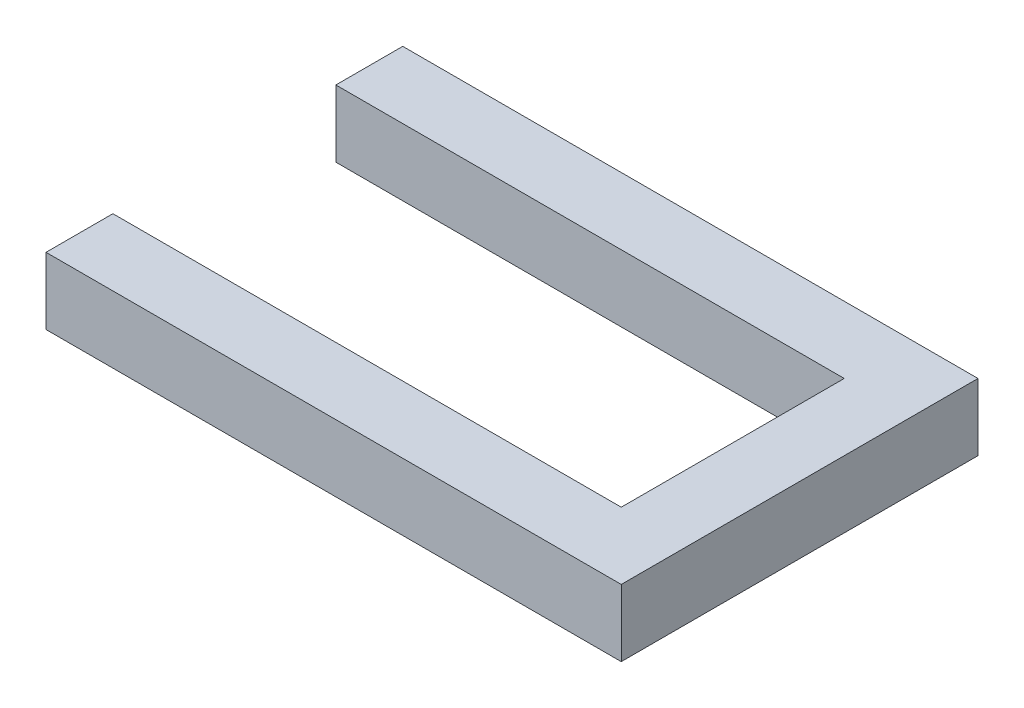
ISO-10303-21;
HEADER;
FILE_DESCRIPTION(('STEP AP214'),'2;1');
FILE_NAME('part.step','',(''),(''),'','','');
FILE_SCHEMA(('AUTOMOTIVE_DESIGN { 1 0 10303 214 1 1 1 1 }'));
ENDSEC;
DATA;
#1=APPLICATION_CONTEXT('core data for automotive mechanical design processes');
#2=APPLICATION_PROTOCOL_DEFINITION('international standard','automotive_design',2000,#1);
#3=PRODUCT_CONTEXT('',#1,'mechanical');
#4=PRODUCT('Part','Part','',(#3));
#5=PRODUCT_RELATED_PRODUCT_CATEGORY('part','',(#4));
#6=PRODUCT_DEFINITION_FORMATION('','',#4);
#7=PRODUCT_DEFINITION_CONTEXT('part definition',#1,'design');
#8=PRODUCT_DEFINITION('design','',#6,#7);
#9=PRODUCT_DEFINITION_SHAPE('','',#8);
#10=(LENGTH_UNIT() NAMED_UNIT(*) SI_UNIT(.MILLI.,.METRE.));
#11=(NAMED_UNIT(*) PLANE_ANGLE_UNIT() SI_UNIT($,.RADIAN.));
#12=(NAMED_UNIT(*) SI_UNIT($,.STERADIAN.) SOLID_ANGLE_UNIT());
#13=UNCERTAINTY_MEASURE_WITH_UNIT(LENGTH_MEASURE(1.E-05),#10,'distance_accuracy_value','');
#14=(GEOMETRIC_REPRESENTATION_CONTEXT(3) GLOBAL_UNCERTAINTY_ASSIGNED_CONTEXT((#13)) GLOBAL_UNIT_ASSIGNED_CONTEXT((#10,
#11,#12)) REPRESENTATION_CONTEXT('',''));
#15=CARTESIAN_POINT('',(0.,0.,0.));
#16=DIRECTION('',(0.,0.,1.));
#17=DIRECTION('',(1.,0.,0.));
#18=AXIS2_PLACEMENT_3D('',#15,#16,#17);
#19=CARTESIAN_POINT('',(-127.,6.34999999999999,-101.6));
#20=DIRECTION('',(-1.,0.,0.));
#21=DIRECTION('',(0.,0.,1.));
#22=AXIS2_PLACEMENT_3D('',#19,#20,#21);
#23=PLANE('',#22);
#24=DIRECTION('',(0.,0.,1.));
#25=VECTOR('',#24,1.);
#26=CARTESIAN_POINT('',(-127.,6.34999999999999,-101.6));
#27=LINE('',#26,#25);
#28=CARTESIAN_POINT('',(-127.,6.34999999999999,-63.5));
#29=VERTEX_POINT('',#28);
#30=CARTESIAN_POINT('',(-127.,6.34999999999999,63.5));
#31=VERTEX_POINT('',#30);
#32=EDGE_CURVE('E53',#29,#31,#27,.T.);
#33=ORIENTED_EDGE('',*,*,#32,.F.);
#34=DIRECTION('',(0.,1.,0.));
#35=VECTOR('',#34,1.);
#36=CARTESIAN_POINT('',(-127.,6.34999999999999,-63.5));
#37=LINE('',#36,#35);
#38=CARTESIAN_POINT('',(-127.,-31.75,-63.5));
#39=VERTEX_POINT('',#38);
#40=EDGE_CURVE('E48',#39,#29,#37,.T.);
#41=ORIENTED_EDGE('',*,*,#40,.F.);
#42=DIRECTION('',(0.,0.,1.));
#43=VECTOR('',#42,1.);
#44=CARTESIAN_POINT('',(-127.,-31.75,-101.6));
#45=LINE('',#44,#43);
#46=CARTESIAN_POINT('',(-127.,-31.75,63.5));
#47=VERTEX_POINT('',#46);
#48=EDGE_CURVE('E35',#39,#47,#45,.T.);
#49=ORIENTED_EDGE('',*,*,#48,.T.);
#50=DIRECTION('',(0.,-1.,0.));
#51=VECTOR('',#50,1.);
#52=CARTESIAN_POINT('',(-127.,6.34999999999998,63.5));
#53=LINE('',#52,#51);
#54=EDGE_CURVE('E135',#31,#47,#53,.T.);
#55=ORIENTED_EDGE('',*,*,#54,.F.);
#56=EDGE_LOOP('',(#33,#41,#49,#55));
#57=FACE_BOUND('',#56,.T.);
#58=ADVANCED_FACE('F31',(#57),#23,.T.);
#59=CARTESIAN_POINT('',(-88.9,6.34999999999999,-101.6));
#60=DIRECTION('',(1.,0.,0.));
#61=DIRECTION('',(0.,0.,-1.));
#62=AXIS2_PLACEMENT_3D('',#59,#60,#61);
#63=PLANE('',#62);
#64=DIRECTION('',(0.,0.,1.));
#65=VECTOR('',#64,1.);
#66=CARTESIAN_POINT('',(-88.9,6.34999999999999,-101.6));
#67=LINE('',#66,#65);
#68=CARTESIAN_POINT('',(-88.9,6.34999999999999,-101.6));
#69=VERTEX_POINT('',#68);
#70=CARTESIAN_POINT('',(-88.9,6.34999999999999,101.6));
#71=VERTEX_POINT('',#70);
#72=EDGE_CURVE('E148',#69,#71,#67,.T.);
#73=ORIENTED_EDGE('',*,*,#72,.T.);
#74=DIRECTION('',(0.,1.,0.));
#75=VECTOR('',#74,1.);
#76=CARTESIAN_POINT('',(-88.9,6.34999999999999,101.6));
#77=LINE('',#76,#75);
#78=CARTESIAN_POINT('',(-88.9,-31.75,101.6));
#79=VERTEX_POINT('',#78);
#80=EDGE_CURVE('E130',#79,#71,#77,.T.);
#81=ORIENTED_EDGE('',*,*,#80,.F.);
#82=DIRECTION('',(0.,0.,1.));
#83=VECTOR('',#82,1.);
#84=CARTESIAN_POINT('',(-88.9,-31.75,-101.6));
#85=LINE('',#84,#83);
#86=CARTESIAN_POINT('',(-88.9,-31.75,-101.6));
#87=VERTEX_POINT('',#86);
#88=EDGE_CURVE('E11',#87,#79,#85,.T.);
#89=ORIENTED_EDGE('',*,*,#88,.F.);
#90=DIRECTION('',(0.,1.,0.));
#91=VECTOR('',#90,1.);
#92=CARTESIAN_POINT('',(-88.9,6.34999999999999,-101.6));
#93=LINE('',#92,#91);
#94=EDGE_CURVE('E275',#87,#69,#93,.T.);
#95=ORIENTED_EDGE('',*,*,#94,.T.);
#96=EDGE_LOOP('',(#73,#81,#89,#95));
#97=FACE_BOUND('',#96,.T.);
#98=ADVANCED_FACE('F33',(#97),#63,.T.);
#99=CARTESIAN_POINT('',(-88.9,-31.75,-101.6));
#100=DIRECTION('',(0.,-1.,0.));
#101=DIRECTION('',(1.,0.,0.));
#102=AXIS2_PLACEMENT_3D('',#99,#100,#101);
#103=PLANE('',#102);
#104=ORIENTED_EDGE('',*,*,#88,.T.);
#105=DIRECTION('',(1.,0.,0.));
#106=VECTOR('',#105,1.);
#107=CARTESIAN_POINT('',(-88.9,-31.75,101.6));
#108=LINE('',#107,#106);
#109=CARTESIAN_POINT('',(-416.560000000226,-31.75,101.6));
#110=VERTEX_POINT('',#109);
#111=EDGE_CURVE('E269',#110,#79,#108,.T.);
#112=ORIENTED_EDGE('',*,*,#111,.F.);
#113=DIRECTION('',(0.,0.,-1.));
#114=VECTOR('',#113,1.);
#115=CARTESIAN_POINT('',(-416.560000000226,-31.75,101.6));
#116=LINE('',#115,#114);
#117=CARTESIAN_POINT('',(-416.560000000226,-31.75,63.5));
#118=VERTEX_POINT('',#117);
#119=EDGE_CURVE('E124',#110,#118,#116,.T.);
#120=ORIENTED_EDGE('',*,*,#119,.T.);
#121=DIRECTION('',(1.,0.,0.));
#122=VECTOR('',#121,1.);
#123=CARTESIAN_POINT('',(-470.441536726641,-31.75,63.5));
#124=LINE('',#123,#122);
#125=EDGE_CURVE('E139',#118,#47,#124,.T.);
#126=ORIENTED_EDGE('',*,*,#125,.T.);
#127=ORIENTED_EDGE('',*,*,#48,.F.);
#128=DIRECTION('',(1.,0.,0.));
#129=VECTOR('',#128,1.);
#130=CARTESIAN_POINT('',(-470.441536726641,-31.75,-63.5));
#131=LINE('',#130,#129);
#132=CARTESIAN_POINT('',(-416.560000000226,-31.75,-63.5));
#133=VERTEX_POINT('',#132);
#134=EDGE_CURVE('E112',#133,#39,#131,.T.);
#135=ORIENTED_EDGE('',*,*,#134,.F.);
#136=DIRECTION('',(0.,0.,-1.));
#137=VECTOR('',#136,1.);
#138=CARTESIAN_POINT('',(-416.560000000226,-31.75,-101.6));
#139=LINE('',#138,#137);
#140=CARTESIAN_POINT('',(-416.560000000226,-31.75,-101.6));
#141=VERTEX_POINT('',#140);
#142=EDGE_CURVE('E104',#133,#141,#139,.T.);
#143=ORIENTED_EDGE('',*,*,#142,.T.);
#144=DIRECTION('',(1.,0.,0.));
#145=VECTOR('',#144,1.);
#146=CARTESIAN_POINT('',(-88.9,-31.75,-101.6));
#147=LINE('',#146,#145);
#148=EDGE_CURVE('E152',#141,#87,#147,.T.);
#149=ORIENTED_EDGE('',*,*,#148,.T.);
#150=EDGE_LOOP('',(#104,#112,#120,#126,#127,#135,#143,#149));
#151=FACE_BOUND('',#150,.T.);
#152=ADVANCED_FACE('F157',(#151),#103,.T.);
#153=CARTESIAN_POINT('',(-88.9,6.34999999999999,-101.6));
#154=DIRECTION('',(0.,1.,0.));
#155=DIRECTION('',(-1.,0.,0.));
#156=AXIS2_PLACEMENT_3D('',#153,#154,#155);
#157=PLANE('',#156);
#158=DIRECTION('',(-1.,0.,0.));
#159=VECTOR('',#158,1.);
#160=CARTESIAN_POINT('',(-88.9,6.34999999999999,-101.6));
#161=LINE('',#160,#159);
#162=CARTESIAN_POINT('',(-416.560000000226,6.34999999999999,-101.6));
#163=VERTEX_POINT('',#162);
#164=EDGE_CURVE('E116',#69,#163,#161,.T.);
#165=ORIENTED_EDGE('',*,*,#164,.T.);
#166=DIRECTION('',(0.,0.,1.));
#167=VECTOR('',#166,1.);
#168=CARTESIAN_POINT('',(-416.560000000226,6.34999999999999,-101.6));
#169=LINE('',#168,#167);
#170=CARTESIAN_POINT('',(-416.560000000226,6.34999999999999,-63.5));
#171=VERTEX_POINT('',#170);
#172=EDGE_CURVE('E101',#163,#171,#169,.T.);
#173=ORIENTED_EDGE('',*,*,#172,.T.);
#174=DIRECTION('',(1.,0.,0.));
#175=VECTOR('',#174,1.);
#176=CARTESIAN_POINT('',(-470.441536726641,6.34999999999999,-63.5));
#177=LINE('',#176,#175);
#178=EDGE_CURVE('E109',#171,#29,#177,.T.);
#179=ORIENTED_EDGE('',*,*,#178,.T.);
#180=ORIENTED_EDGE('',*,*,#32,.T.);
#181=DIRECTION('',(1.,0.,0.));
#182=VECTOR('',#181,1.);
#183=CARTESIAN_POINT('',(-470.441536726641,6.34999999999998,63.5));
#184=LINE('',#183,#182);
#185=CARTESIAN_POINT('',(-416.560000000226,6.34999999999998,63.5));
#186=VERTEX_POINT('',#185);
#187=EDGE_CURVE('E143',#186,#31,#184,.T.);
#188=ORIENTED_EDGE('',*,*,#187,.F.);
#189=DIRECTION('',(0.,0.,1.));
#190=VECTOR('',#189,1.);
#191=CARTESIAN_POINT('',(-416.560000000226,6.34999999999999,101.6));
#192=LINE('',#191,#190);
#193=CARTESIAN_POINT('',(-416.560000000226,6.34999999999999,101.6));
#194=VERTEX_POINT('',#193);
#195=EDGE_CURVE('E123',#186,#194,#192,.T.);
#196=ORIENTED_EDGE('',*,*,#195,.T.);
#197=DIRECTION('',(-1.,0.,0.));
#198=VECTOR('',#197,1.);
#199=CARTESIAN_POINT('',(-88.9,6.34999999999999,101.6));
#200=LINE('',#199,#198);
#201=EDGE_CURVE('E267',#71,#194,#200,.T.);
#202=ORIENTED_EDGE('',*,*,#201,.F.);
#203=ORIENTED_EDGE('',*,*,#72,.F.);
#204=EDGE_LOOP('',(#165,#173,#179,#180,#188,#196,#202,#203));
#205=FACE_BOUND('',#204,.T.);
#206=ADVANCED_FACE('F114',(#205),#157,.T.);
#207=CARTESIAN_POINT('',(-88.9,-31.75,-101.6));
#208=DIRECTION('',(0.,0.,-1.));
#209=DIRECTION('',(-1.,0.,0.));
#210=AXIS2_PLACEMENT_3D('',#207,#208,#209);
#211=PLANE('',#210);
#212=ORIENTED_EDGE('',*,*,#94,.F.);
#213=ORIENTED_EDGE('',*,*,#148,.F.);
#214=DIRECTION('',(0.,1.,0.));
#215=VECTOR('',#214,1.);
#216=CARTESIAN_POINT('',(-416.560000000226,6.34999999999999,-101.6));
#217=LINE('',#216,#215);
#218=EDGE_CURVE('E140',#141,#163,#217,.T.);
#219=ORIENTED_EDGE('',*,*,#218,.T.);
#220=ORIENTED_EDGE('',*,*,#164,.F.);
#221=EDGE_LOOP('',(#212,#213,#219,#220));
#222=FACE_BOUND('',#221,.T.);
#223=ADVANCED_FACE('F171',(#222),#211,.T.);
#224=CARTESIAN_POINT('',(-88.9,-31.75,101.6));
#225=DIRECTION('',(0.,0.,-1.));
#226=DIRECTION('',(-1.,0.,0.));
#227=AXIS2_PLACEMENT_3D('',#224,#225,#226);
#228=PLANE('',#227);
#229=ORIENTED_EDGE('',*,*,#80,.T.);
#230=ORIENTED_EDGE('',*,*,#201,.T.);
#231=DIRECTION('',(0.,-1.,0.));
#232=VECTOR('',#231,1.);
#233=CARTESIAN_POINT('',(-416.560000000226,6.34999999999999,101.6));
#234=LINE('',#233,#232);
#235=EDGE_CURVE('E127',#194,#110,#234,.T.);
#236=ORIENTED_EDGE('',*,*,#235,.T.);
#237=ORIENTED_EDGE('',*,*,#111,.T.);
#238=EDGE_LOOP('',(#229,#230,#236,#237));
#239=FACE_BOUND('',#238,.T.);
#240=ADVANCED_FACE('F176',(#239),#228,.F.);
#241=CARTESIAN_POINT('',(-470.441536726641,6.34999999999998,63.5));
#242=DIRECTION('',(0.,0.,1.));
#243=DIRECTION('',(1.,0.,0.));
#244=AXIS2_PLACEMENT_3D('',#241,#242,#243);
#245=PLANE('',#244);
#246=ORIENTED_EDGE('',*,*,#125,.F.);
#247=DIRECTION('',(0.,1.,0.));
#248=VECTOR('',#247,1.);
#249=CARTESIAN_POINT('',(-416.560000000226,6.34999999999998,63.5));
#250=LINE('',#249,#248);
#251=EDGE_CURVE('E120',#118,#186,#250,.T.);
#252=ORIENTED_EDGE('',*,*,#251,.T.);
#253=ORIENTED_EDGE('',*,*,#187,.T.);
#254=ORIENTED_EDGE('',*,*,#54,.T.);
#255=EDGE_LOOP('',(#246,#252,#253,#254));
#256=FACE_BOUND('',#255,.T.);
#257=ADVANCED_FACE('F160',(#256),#245,.F.);
#258=CARTESIAN_POINT('',(-416.560000000225,-841.120999999988,2249.42400000015));
#259=DIRECTION('',(1.,0.,0.));
#260=DIRECTION('',(0.,-1.,0.));
#261=AXIS2_PLACEMENT_3D('',#258,#259,#260);
#262=PLANE('',#261);
#263=ORIENTED_EDGE('',*,*,#195,.F.);
#264=ORIENTED_EDGE('',*,*,#251,.F.);
#265=ORIENTED_EDGE('',*,*,#119,.F.);
#266=ORIENTED_EDGE('',*,*,#235,.F.);
#267=EDGE_LOOP('',(#263,#264,#265,#266));
#268=FACE_BOUND('',#267,.T.);
#269=ADVANCED_FACE('F235',(#268),#262,.F.);
#270=CARTESIAN_POINT('',(-470.441536726641,6.34999999999999,-63.5));
#271=DIRECTION('',(0.,0.,-1.));
#272=DIRECTION('',(-1.,0.,0.));
#273=AXIS2_PLACEMENT_3D('',#270,#271,#272);
#274=PLANE('',#273);
#275=ORIENTED_EDGE('',*,*,#178,.F.);
#276=DIRECTION('',(0.,-1.,0.));
#277=VECTOR('',#276,1.);
#278=CARTESIAN_POINT('',(-416.560000000226,6.34999999999999,-63.5));
#279=LINE('',#278,#277);
#280=EDGE_CURVE('E96',#171,#133,#279,.T.);
#281=ORIENTED_EDGE('',*,*,#280,.T.);
#282=ORIENTED_EDGE('',*,*,#134,.T.);
#283=ORIENTED_EDGE('',*,*,#40,.T.);
#284=EDGE_LOOP('',(#275,#281,#282,#283));
#285=FACE_BOUND('',#284,.T.);
#286=ADVANCED_FACE('F110',(#285),#274,.F.);
#287=CARTESIAN_POINT('',(-416.560000000225,-841.120999999988,2249.42400000015));
#288=DIRECTION('',(1.,0.,0.));
#289=DIRECTION('',(0.,-1.,0.));
#290=AXIS2_PLACEMENT_3D('',#287,#288,#289);
#291=PLANE('',#290);
#292=ORIENTED_EDGE('',*,*,#142,.F.);
#293=ORIENTED_EDGE('',*,*,#280,.F.);
#294=ORIENTED_EDGE('',*,*,#172,.F.);
#295=ORIENTED_EDGE('',*,*,#218,.F.);
#296=EDGE_LOOP('',(#292,#293,#294,#295));
#297=FACE_BOUND('',#296,.T.);
#298=ADVANCED_FACE('F98',(#297),#291,.F.);
#299=CLOSED_SHELL('',(#58,#98,#152,#206,#223,#240,#257,#269,#286,#298));
#300=MANIFOLD_SOLID_BREP('B2',#299);
#301=ADVANCED_BREP_SHAPE_REPRESENTATION('',(#18,#300),#14);
#302=SHAPE_DEFINITION_REPRESENTATION(#9,#301);
ENDSEC;
END-ISO-10303-21;
